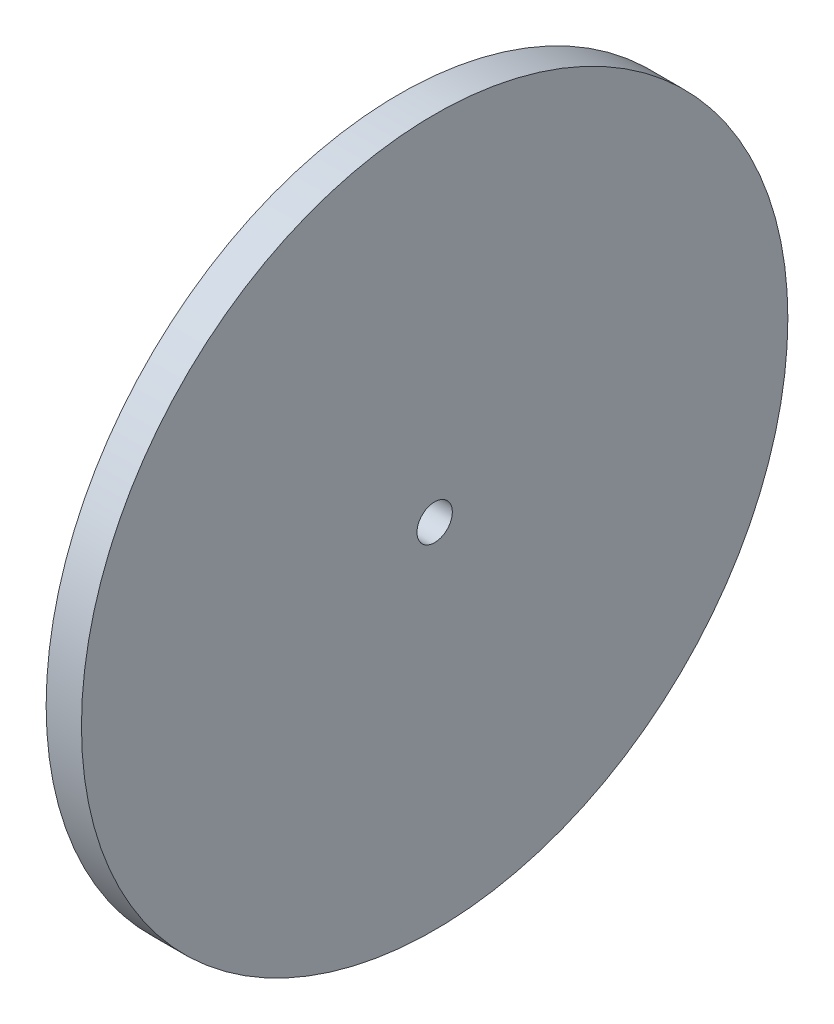
ISO-10303-21;
HEADER;
FILE_DESCRIPTION(('STEP AP214'),'2;1');
FILE_NAME('part.step','',(''),(''),'','','');
FILE_SCHEMA(('AUTOMOTIVE_DESIGN { 1 0 10303 214 1 1 1 1 }'));
ENDSEC;
DATA;
#1=APPLICATION_CONTEXT('core data for automotive mechanical design processes');
#2=APPLICATION_PROTOCOL_DEFINITION('international standard','automotive_design',2000,#1);
#3=PRODUCT_CONTEXT('',#1,'mechanical');
#4=PRODUCT('Part','Part','',(#3));
#5=PRODUCT_RELATED_PRODUCT_CATEGORY('part','',(#4));
#6=PRODUCT_DEFINITION_FORMATION('','',#4);
#7=PRODUCT_DEFINITION_CONTEXT('part definition',#1,'design');
#8=PRODUCT_DEFINITION('design','',#6,#7);
#9=PRODUCT_DEFINITION_SHAPE('','',#8);
#10=(LENGTH_UNIT() NAMED_UNIT(*) SI_UNIT(.MILLI.,.METRE.));
#11=(NAMED_UNIT(*) PLANE_ANGLE_UNIT() SI_UNIT($,.RADIAN.));
#12=(NAMED_UNIT(*) SI_UNIT($,.STERADIAN.) SOLID_ANGLE_UNIT());
#13=UNCERTAINTY_MEASURE_WITH_UNIT(LENGTH_MEASURE(1.E-05),#10,'distance_accuracy_value','');
#14=(GEOMETRIC_REPRESENTATION_CONTEXT(3) GLOBAL_UNCERTAINTY_ASSIGNED_CONTEXT((#13)) GLOBAL_UNIT_ASSIGNED_CONTEXT((#10,
#11,#12)) REPRESENTATION_CONTEXT('',''));
#15=CARTESIAN_POINT('',(0.,0.,0.));
#16=DIRECTION('',(0.,0.,1.));
#17=DIRECTION('',(1.,0.,0.));
#18=AXIS2_PLACEMENT_3D('',#15,#16,#17);
#19=CARTESIAN_POINT('',(6.35,0.,0.));
#20=DIRECTION('',(1.,0.,0.));
#21=DIRECTION('',(0.,0.,-1.));
#22=AXIS2_PLACEMENT_3D('',#19,#20,#21);
#23=PLANE('',#22);
#24=CARTESIAN_POINT('',(6.35,0.,0.));
#25=DIRECTION('',(1.,0.,0.));
#26=DIRECTION('',(0.,0.,-1.));
#27=AXIS2_PLACEMENT_3D('',#24,#25,#26);
#28=CIRCLE('',#27,63.5);
#29=CARTESIAN_POINT('',(6.35,0.,-63.5));
#30=VERTEX_POINT('',#29);
#31=EDGE_CURVE('E10',#30,#30,#28,.T.);
#32=ORIENTED_EDGE('',*,*,#31,.T.);
#33=EDGE_LOOP('',(#32));
#34=FACE_BOUND('',#33,.T.);
#35=CARTESIAN_POINT('',(6.35,0.,0.));
#36=DIRECTION('',(1.,0.,0.));
#37=DIRECTION('',(0.,0.,-1.));
#38=AXIS2_PLACEMENT_3D('',#35,#36,#37);
#39=CIRCLE('',#38,3.175);
#40=CARTESIAN_POINT('',(6.35,0.,-3.175));
#41=VERTEX_POINT('',#40);
#42=EDGE_CURVE('E57',#41,#41,#39,.T.);
#43=ORIENTED_EDGE('',*,*,#42,.F.);
#44=EDGE_LOOP('',(#43));
#45=FACE_BOUND('',#44,.T.);
#46=ADVANCED_FACE('F43',(#34,#45),#23,.T.);
#47=CARTESIAN_POINT('',(0.,0.,0.));
#48=DIRECTION('',(1.,0.,0.));
#49=DIRECTION('',(0.,0.,-1.));
#50=AXIS2_PLACEMENT_3D('',#47,#48,#49);
#51=PLANE('',#50);
#52=CARTESIAN_POINT('',(0.,0.,0.));
#53=DIRECTION('',(1.,0.,0.));
#54=DIRECTION('',(0.,0.,-1.));
#55=AXIS2_PLACEMENT_3D('',#52,#53,#54);
#56=CIRCLE('',#55,63.5);
#57=CARTESIAN_POINT('',(0.,0.,-63.5));
#58=VERTEX_POINT('',#57);
#59=EDGE_CURVE('E50',#58,#58,#56,.T.);
#60=ORIENTED_EDGE('',*,*,#59,.F.);
#61=EDGE_LOOP('',(#60));
#62=FACE_BOUND('',#61,.T.);
#63=CARTESIAN_POINT('',(0.,0.,0.));
#64=DIRECTION('',(1.,0.,0.));
#65=DIRECTION('',(0.,0.,-1.));
#66=AXIS2_PLACEMENT_3D('',#63,#64,#65);
#67=CIRCLE('',#66,3.175);
#68=CARTESIAN_POINT('',(0.,0.,-3.175));
#69=VERTEX_POINT('',#68);
#70=EDGE_CURVE('E59',#69,#69,#67,.T.);
#71=ORIENTED_EDGE('',*,*,#70,.T.);
#72=EDGE_LOOP('',(#71));
#73=FACE_BOUND('',#72,.T.);
#74=ADVANCED_FACE('F68',(#62,#73),#51,.F.);
#75=CARTESIAN_POINT('',(6.35,0.,0.));
#76=DIRECTION('',(-1.,0.,0.));
#77=DIRECTION('',(0.,0.,1.));
#78=AXIS2_PLACEMENT_3D('',#75,#76,#77);
#79=CYLINDRICAL_SURFACE('',#78,63.5);
#80=ORIENTED_EDGE('',*,*,#31,.F.);
#81=EDGE_LOOP('',(#80));
#82=FACE_BOUND('',#81,.T.);
#83=ORIENTED_EDGE('',*,*,#59,.T.);
#84=EDGE_LOOP('',(#83));
#85=FACE_BOUND('',#84,.T.);
#86=ADVANCED_FACE('F44',(#82,#85),#79,.T.);
#87=CARTESIAN_POINT('',(6.35,0.,0.));
#88=DIRECTION('',(-1.,0.,0.));
#89=DIRECTION('',(0.,0.,1.));
#90=AXIS2_PLACEMENT_3D('',#87,#88,#89);
#91=CYLINDRICAL_SURFACE('',#90,3.175);
#92=ORIENTED_EDGE('',*,*,#42,.T.);
#93=EDGE_LOOP('',(#92));
#94=FACE_BOUND('',#93,.T.);
#95=ORIENTED_EDGE('',*,*,#70,.F.);
#96=EDGE_LOOP('',(#95));
#97=FACE_BOUND('',#96,.T.);
#98=ADVANCED_FACE('F67',(#94,#97),#91,.F.);
#99=CLOSED_SHELL('',(#46,#74,#86,#98));
#100=MANIFOLD_SOLID_BREP('B2',#99);
#101=ADVANCED_BREP_SHAPE_REPRESENTATION('',(#18,#100),#14);
#102=SHAPE_DEFINITION_REPRESENTATION(#9,#101);
ENDSEC;
END-ISO-10303-21;
